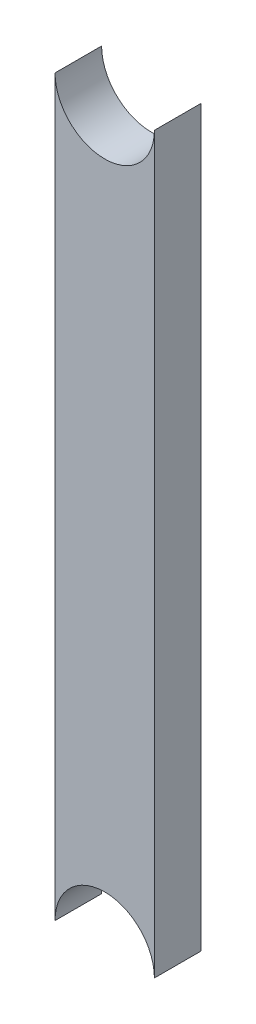
ISO-10303-21;
HEADER;
FILE_DESCRIPTION(('STEP AP214'),'2;1');
FILE_NAME('part.step','',(''),(''),'','','');
FILE_SCHEMA(('AUTOMOTIVE_DESIGN { 1 0 10303 214 1 1 1 1 }'));
ENDSEC;
DATA;
#1=APPLICATION_CONTEXT('core data for automotive mechanical design processes');
#2=APPLICATION_PROTOCOL_DEFINITION('international standard','automotive_design',2000,#1);
#3=PRODUCT_CONTEXT('',#1,'mechanical');
#4=PRODUCT('Part','Part','',(#3));
#5=PRODUCT_RELATED_PRODUCT_CATEGORY('part','',(#4));
#6=PRODUCT_DEFINITION_FORMATION('','',#4);
#7=PRODUCT_DEFINITION_CONTEXT('part definition',#1,'design');
#8=PRODUCT_DEFINITION('design','',#6,#7);
#9=PRODUCT_DEFINITION_SHAPE('','',#8);
#10=(LENGTH_UNIT() NAMED_UNIT(*) SI_UNIT(.MILLI.,.METRE.));
#11=(NAMED_UNIT(*) PLANE_ANGLE_UNIT() SI_UNIT($,.RADIAN.));
#12=(NAMED_UNIT(*) SI_UNIT($,.STERADIAN.) SOLID_ANGLE_UNIT());
#13=UNCERTAINTY_MEASURE_WITH_UNIT(LENGTH_MEASURE(1.E-05),#10,'distance_accuracy_value','');
#14=(GEOMETRIC_REPRESENTATION_CONTEXT(3) GLOBAL_UNCERTAINTY_ASSIGNED_CONTEXT((#13)) GLOBAL_UNIT_ASSIGNED_CONTEXT((#10,
#11,#12)) REPRESENTATION_CONTEXT('',''));
#15=CARTESIAN_POINT('',(0.,0.,0.));
#16=DIRECTION('',(0.,0.,1.));
#17=DIRECTION('',(1.,0.,0.));
#18=AXIS2_PLACEMENT_3D('',#15,#16,#17);
#19=CARTESIAN_POINT('',(0.,47.2744,3.));
#20=DIRECTION('',(0.,0.,-1.));
#21=DIRECTION('',(-1.,0.,0.));
#22=AXIS2_PLACEMENT_3D('',#19,#20,#21);
#23=CYLINDRICAL_SURFACE('',#22,3.2);
#24=CARTESIAN_POINT('',(0.,47.2744,0.));
#25=DIRECTION('',(0.,0.,-1.));
#26=DIRECTION('',(1.,0.,0.));
#27=AXIS2_PLACEMENT_3D('',#24,#25,#26);
#28=CIRCLE('',#27,3.2);
#29=CARTESIAN_POINT('',(3.2,47.2744,0.));
#30=VERTEX_POINT('',#29);
#31=CARTESIAN_POINT('',(-3.2,47.2744,0.));
#32=VERTEX_POINT('',#31);
#33=EDGE_CURVE('E104',#30,#32,#28,.T.);
#34=ORIENTED_EDGE('',*,*,#33,.T.);
#35=DIRECTION('',(0.,0.,-1.));
#36=VECTOR('',#35,1.);
#37=CARTESIAN_POINT('',(-3.2,47.2744,3.));
#38=LINE('',#37,#36);
#39=CARTESIAN_POINT('',(-3.2,47.2744,3.));
#40=VERTEX_POINT('',#39);
#41=EDGE_CURVE('E11',#40,#32,#38,.T.);
#42=ORIENTED_EDGE('',*,*,#41,.F.);
#43=CARTESIAN_POINT('',(0.,47.2744,3.));
#44=DIRECTION('',(0.,0.,-1.));
#45=DIRECTION('',(1.,0.,0.));
#46=AXIS2_PLACEMENT_3D('',#43,#44,#45);
#47=CIRCLE('',#46,3.2);
#48=CARTESIAN_POINT('',(3.2,47.2744,3.));
#49=VERTEX_POINT('',#48);
#50=EDGE_CURVE('E92',#49,#40,#47,.T.);
#51=ORIENTED_EDGE('',*,*,#50,.F.);
#52=DIRECTION('',(0.,0.,-1.));
#53=VECTOR('',#52,1.);
#54=CARTESIAN_POINT('',(3.2,47.2744,3.));
#55=LINE('',#54,#53);
#56=EDGE_CURVE('E100',#49,#30,#55,.T.);
#57=ORIENTED_EDGE('',*,*,#56,.T.);
#58=EDGE_LOOP('',(#34,#42,#51,#57));
#59=FACE_BOUND('',#58,.T.);
#60=ADVANCED_FACE('F41',(#59),#23,.F.);
#61=CARTESIAN_POINT('',(-3.2,0.,3.));
#62=DIRECTION('',(1.,0.,0.));
#63=DIRECTION('',(0.,1.,0.));
#64=AXIS2_PLACEMENT_3D('',#61,#62,#63);
#65=PLANE('',#64);
#66=DIRECTION('',(0.,-1.,0.));
#67=VECTOR('',#66,1.);
#68=CARTESIAN_POINT('',(-3.2,0.,0.));
#69=LINE('',#68,#67);
#70=CARTESIAN_POINT('',(-3.2,0.,0.));
#71=VERTEX_POINT('',#70);
#72=EDGE_CURVE('E96',#32,#71,#69,.T.);
#73=ORIENTED_EDGE('',*,*,#72,.T.);
#74=DIRECTION('',(0.,0.,-1.));
#75=VECTOR('',#74,1.);
#76=CARTESIAN_POINT('',(-3.2,0.,3.));
#77=LINE('',#76,#75);
#78=CARTESIAN_POINT('',(-3.2,0.,3.));
#79=VERTEX_POINT('',#78);
#80=EDGE_CURVE('E49',#79,#71,#77,.T.);
#81=ORIENTED_EDGE('',*,*,#80,.F.);
#82=DIRECTION('',(0.,-1.,0.));
#83=VECTOR('',#82,1.);
#84=CARTESIAN_POINT('',(-3.2,0.,3.));
#85=LINE('',#84,#83);
#86=EDGE_CURVE('E87',#40,#79,#85,.T.);
#87=ORIENTED_EDGE('',*,*,#86,.F.);
#88=ORIENTED_EDGE('',*,*,#41,.T.);
#89=EDGE_LOOP('',(#73,#81,#87,#88));
#90=FACE_BOUND('',#89,.T.);
#91=ADVANCED_FACE('F95',(#90),#65,.F.);
#92=CARTESIAN_POINT('',(0.,0.,3.));
#93=DIRECTION('',(0.,0.,-1.));
#94=DIRECTION('',(-1.,0.,0.));
#95=AXIS2_PLACEMENT_3D('',#92,#93,#94);
#96=CYLINDRICAL_SURFACE('',#95,3.2);
#97=CARTESIAN_POINT('',(0.,0.,0.));
#98=DIRECTION('',(0.,0.,-1.));
#99=DIRECTION('',(1.,0.,0.));
#100=AXIS2_PLACEMENT_3D('',#97,#98,#99);
#101=CIRCLE('',#100,3.2);
#102=CARTESIAN_POINT('',(3.2,0.,0.));
#103=VERTEX_POINT('',#102);
#104=EDGE_CURVE('E74',#71,#103,#101,.T.);
#105=ORIENTED_EDGE('',*,*,#104,.T.);
#106=DIRECTION('',(0.,0.,-1.));
#107=VECTOR('',#106,1.);
#108=CARTESIAN_POINT('',(3.2,0.,3.));
#109=LINE('',#108,#107);
#110=CARTESIAN_POINT('',(3.2,0.,3.));
#111=VERTEX_POINT('',#110);
#112=EDGE_CURVE('E97',#111,#103,#109,.T.);
#113=ORIENTED_EDGE('',*,*,#112,.F.);
#114=CARTESIAN_POINT('',(0.,0.,3.));
#115=DIRECTION('',(0.,0.,-1.));
#116=DIRECTION('',(1.,0.,0.));
#117=AXIS2_PLACEMENT_3D('',#114,#115,#116);
#118=CIRCLE('',#117,3.2);
#119=EDGE_CURVE('E90',#79,#111,#118,.T.);
#120=ORIENTED_EDGE('',*,*,#119,.F.);
#121=ORIENTED_EDGE('',*,*,#80,.T.);
#122=EDGE_LOOP('',(#105,#113,#120,#121));
#123=FACE_BOUND('',#122,.T.);
#124=ADVANCED_FACE('F98',(#123),#96,.F.);
#125=CARTESIAN_POINT('',(3.2,47.2744,3.));
#126=DIRECTION('',(-1.,0.,0.));
#127=DIRECTION('',(0.,-1.,0.));
#128=AXIS2_PLACEMENT_3D('',#125,#126,#127);
#129=PLANE('',#128);
#130=DIRECTION('',(0.,1.,0.));
#131=VECTOR('',#130,1.);
#132=CARTESIAN_POINT('',(3.2,47.2744,0.));
#133=LINE('',#132,#131);
#134=EDGE_CURVE('E80',#103,#30,#133,.T.);
#135=ORIENTED_EDGE('',*,*,#134,.T.);
#136=ORIENTED_EDGE('',*,*,#56,.F.);
#137=DIRECTION('',(0.,1.,0.));
#138=VECTOR('',#137,1.);
#139=CARTESIAN_POINT('',(3.2,47.2744,3.));
#140=LINE('',#139,#138);
#141=EDGE_CURVE('E57',#111,#49,#140,.T.);
#142=ORIENTED_EDGE('',*,*,#141,.F.);
#143=ORIENTED_EDGE('',*,*,#112,.T.);
#144=EDGE_LOOP('',(#135,#136,#142,#143));
#145=FACE_BOUND('',#144,.T.);
#146=ADVANCED_FACE('F111',(#145),#129,.F.);
#147=CARTESIAN_POINT('',(0.,47.2744,3.));
#148=DIRECTION('',(0.,0.,1.));
#149=DIRECTION('',(1.,0.,0.));
#150=AXIS2_PLACEMENT_3D('',#147,#148,#149);
#151=PLANE('',#150);
#152=ORIENTED_EDGE('',*,*,#50,.T.);
#153=ORIENTED_EDGE('',*,*,#86,.T.);
#154=ORIENTED_EDGE('',*,*,#119,.T.);
#155=ORIENTED_EDGE('',*,*,#141,.T.);
#156=EDGE_LOOP('',(#152,#153,#154,#155));
#157=FACE_BOUND('',#156,.T.);
#158=ADVANCED_FACE('F88',(#157),#151,.T.);
#159=CARTESIAN_POINT('',(0.,47.2744,0.));
#160=DIRECTION('',(0.,0.,1.));
#161=DIRECTION('',(1.,0.,0.));
#162=AXIS2_PLACEMENT_3D('',#159,#160,#161);
#163=PLANE('',#162);
#164=ORIENTED_EDGE('',*,*,#33,.F.);
#165=ORIENTED_EDGE('',*,*,#134,.F.);
#166=ORIENTED_EDGE('',*,*,#104,.F.);
#167=ORIENTED_EDGE('',*,*,#72,.F.);
#168=EDGE_LOOP('',(#164,#165,#166,#167));
#169=FACE_BOUND('',#168,.T.);
#170=ADVANCED_FACE('F114',(#169),#163,.F.);
#171=CLOSED_SHELL('',(#60,#91,#124,#146,#158,#170));
#172=MANIFOLD_SOLID_BREP('B2',#171);
#173=ADVANCED_BREP_SHAPE_REPRESENTATION('',(#18,#172),#14);
#174=SHAPE_DEFINITION_REPRESENTATION(#9,#173);
ENDSEC;
END-ISO-10303-21;
